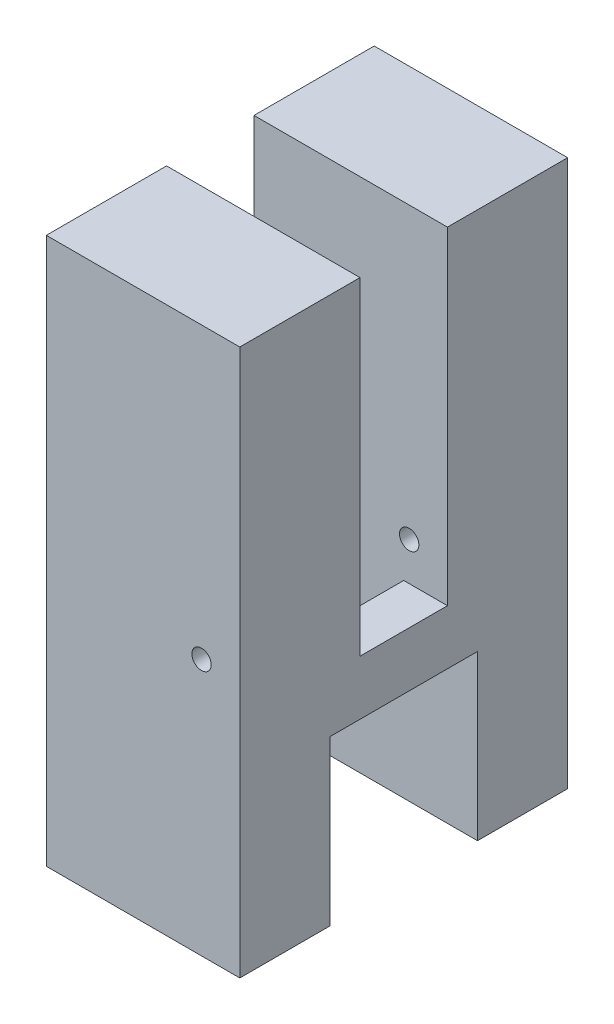
ISO-10303-21;
HEADER;
FILE_DESCRIPTION(('STEP AP214'),'2;1');
FILE_NAME('part.step','',(''),(''),'','','');
FILE_SCHEMA(('AUTOMOTIVE_DESIGN { 1 0 10303 214 1 1 1 1 }'));
ENDSEC;
DATA;
#1=APPLICATION_CONTEXT('core data for automotive mechanical design processes');
#2=APPLICATION_PROTOCOL_DEFINITION('international standard','automotive_design',2000,#1);
#3=PRODUCT_CONTEXT('',#1,'mechanical');
#4=PRODUCT('Part','Part','',(#3));
#5=PRODUCT_RELATED_PRODUCT_CATEGORY('part','',(#4));
#6=PRODUCT_DEFINITION_FORMATION('','',#4);
#7=PRODUCT_DEFINITION_CONTEXT('part definition',#1,'design');
#8=PRODUCT_DEFINITION('design','',#6,#7);
#9=PRODUCT_DEFINITION_SHAPE('','',#8);
#10=(LENGTH_UNIT() NAMED_UNIT(*) SI_UNIT(.MILLI.,.METRE.));
#11=(NAMED_UNIT(*) PLANE_ANGLE_UNIT() SI_UNIT($,.RADIAN.));
#12=(NAMED_UNIT(*) SI_UNIT($,.STERADIAN.) SOLID_ANGLE_UNIT());
#13=UNCERTAINTY_MEASURE_WITH_UNIT(LENGTH_MEASURE(1.E-05),#10,'distance_accuracy_value','');
#14=(GEOMETRIC_REPRESENTATION_CONTEXT(3) GLOBAL_UNCERTAINTY_ASSIGNED_CONTEXT((#13)) GLOBAL_UNIT_ASSIGNED_CONTEXT((#10,
#11,#12)) REPRESENTATION_CONTEXT('',''));
#15=CARTESIAN_POINT('',(0.,0.,0.));
#16=DIRECTION('',(0.,0.,1.));
#17=DIRECTION('',(1.,0.,0.));
#18=AXIS2_PLACEMENT_3D('',#15,#16,#17);
#19=CARTESIAN_POINT('',(-18.034,25.4,5.08));
#20=DIRECTION('',(0.,0.,1.));
#21=DIRECTION('',(1.,0.,0.));
#22=AXIS2_PLACEMENT_3D('',#19,#20,#21);
#23=PLANE('',#22);
#24=CARTESIAN_POINT('',(0.,29.845,5.08));
#25=DIRECTION('',(0.,0.,1.));
#26=DIRECTION('',(1.,0.,0.));
#27=AXIS2_PLACEMENT_3D('',#24,#25,#26);
#28=CIRCLE('',#27,1.125);
#29=CARTESIAN_POINT('',(1.125,29.845,5.08));
#30=VERTEX_POINT('',#29);
#31=EDGE_CURVE('E190',#30,#30,#28,.T.);
#32=ORIENTED_EDGE('',*,*,#31,.T.);
#33=EDGE_LOOP('',(#32));
#34=FACE_BOUND('',#33,.T.);
#35=DIRECTION('',(0.,-1.,0.));
#36=VECTOR('',#35,1.);
#37=CARTESIAN_POINT('',(4.445,25.4,5.08));
#38=LINE('',#37,#36);
#39=CARTESIAN_POINT('',(4.445,63.5,5.07999999999999));
#40=VERTEX_POINT('',#39);
#41=CARTESIAN_POINT('',(4.445,25.4,5.08));
#42=VERTEX_POINT('',#41);
#43=EDGE_CURVE('E203',#40,#42,#38,.T.);
#44=ORIENTED_EDGE('',*,*,#43,.T.);
#45=DIRECTION('',(1.,0.,0.));
#46=VECTOR('',#45,1.);
#47=CARTESIAN_POINT('',(-18.034,25.4,5.08));
#48=LINE('',#47,#46);
#49=CARTESIAN_POINT('',(-0.635,25.4,5.08));
#50=VERTEX_POINT('',#49);
#51=EDGE_CURVE('E60',#50,#42,#48,.T.);
#52=ORIENTED_EDGE('',*,*,#51,.F.);
#53=DIRECTION('',(0.,1.,0.));
#54=VECTOR('',#53,1.);
#55=CARTESIAN_POINT('',(-0.635,0.,5.08));
#56=LINE('',#55,#54);
#57=CARTESIAN_POINT('',(-0.635,19.05,5.08));
#58=VERTEX_POINT('',#57);
#59=EDGE_CURVE('E209',#58,#50,#56,.T.);
#60=ORIENTED_EDGE('',*,*,#59,.F.);
#61=DIRECTION('',(1.,0.,0.));
#62=VECTOR('',#61,1.);
#63=CARTESIAN_POINT('',(0.,19.05,5.08));
#64=LINE('',#63,#62);
#65=CARTESIAN_POINT('',(-18.034,19.05,5.08));
#66=VERTEX_POINT('',#65);
#67=EDGE_CURVE('E45',#66,#58,#64,.T.);
#68=ORIENTED_EDGE('',*,*,#67,.F.);
#69=DIRECTION('',(0.,1.,0.));
#70=VECTOR('',#69,1.);
#71=CARTESIAN_POINT('',(-18.034,25.4,5.08));
#72=LINE('',#71,#70);
#73=CARTESIAN_POINT('',(-18.034,63.5,5.08));
#74=VERTEX_POINT('',#73);
#75=EDGE_CURVE('E164',#66,#74,#72,.T.);
#76=ORIENTED_EDGE('',*,*,#75,.T.);
#77=DIRECTION('',(1.,0.,0.));
#78=VECTOR('',#77,1.);
#79=CARTESIAN_POINT('',(-18.034,63.5,5.08));
#80=LINE('',#79,#78);
#81=EDGE_CURVE('E233',#74,#40,#80,.T.);
#82=ORIENTED_EDGE('',*,*,#81,.T.);
#83=EDGE_LOOP('',(#44,#52,#60,#68,#76,#82));
#84=FACE_BOUND('',#83,.T.);
#85=ADVANCED_FACE('F37',(#34,#84),#23,.F.);
#86=CARTESIAN_POINT('',(-18.034,25.4,-5.08));
#87=DIRECTION('',(0.,0.,-1.));
#88=DIRECTION('',(-1.,0.,0.));
#89=AXIS2_PLACEMENT_3D('',#86,#87,#88);
#90=PLANE('',#89);
#91=CARTESIAN_POINT('',(0.,29.845,-5.08));
#92=DIRECTION('',(0.,0.,-1.));
#93=DIRECTION('',(-1.,0.,0.));
#94=AXIS2_PLACEMENT_3D('',#91,#92,#93);
#95=CIRCLE('',#94,1.125);
#96=CARTESIAN_POINT('',(-1.125,29.845,-5.08));
#97=VERTEX_POINT('',#96);
#98=EDGE_CURVE('E188',#97,#97,#95,.T.);
#99=ORIENTED_EDGE('',*,*,#98,.T.);
#100=EDGE_LOOP('',(#99));
#101=FACE_BOUND('',#100,.T.);
#102=DIRECTION('',(-1.,0.,0.));
#103=VECTOR('',#102,1.);
#104=CARTESIAN_POINT('',(-18.034,25.4,-5.08));
#105=LINE('',#104,#103);
#106=CARTESIAN_POINT('',(4.445,25.4,-5.08));
#107=VERTEX_POINT('',#106);
#108=CARTESIAN_POINT('',(-0.635,25.4,-5.08));
#109=VERTEX_POINT('',#108);
#110=EDGE_CURVE('E52',#107,#109,#105,.T.);
#111=ORIENTED_EDGE('',*,*,#110,.F.);
#112=DIRECTION('',(0.,1.,0.));
#113=VECTOR('',#112,1.);
#114=CARTESIAN_POINT('',(4.445,25.4,-5.08));
#115=LINE('',#114,#113);
#116=CARTESIAN_POINT('',(4.445,63.5,-5.08));
#117=VERTEX_POINT('',#116);
#118=EDGE_CURVE('E262',#107,#117,#115,.T.);
#119=ORIENTED_EDGE('',*,*,#118,.T.);
#120=DIRECTION('',(-1.,0.,0.));
#121=VECTOR('',#120,1.);
#122=CARTESIAN_POINT('',(-18.034,63.5,-5.08));
#123=LINE('',#122,#121);
#124=CARTESIAN_POINT('',(-18.034,63.5,-5.08));
#125=VERTEX_POINT('',#124);
#126=EDGE_CURVE('E223',#117,#125,#123,.T.);
#127=ORIENTED_EDGE('',*,*,#126,.T.);
#128=DIRECTION('',(0.,1.,0.));
#129=VECTOR('',#128,1.);
#130=CARTESIAN_POINT('',(-18.034,25.4,-5.08));
#131=LINE('',#130,#129);
#132=CARTESIAN_POINT('',(-18.034,19.05,-5.08));
#133=VERTEX_POINT('',#132);
#134=EDGE_CURVE('E167',#133,#125,#131,.T.);
#135=ORIENTED_EDGE('',*,*,#134,.F.);
#136=DIRECTION('',(-1.,0.,0.));
#137=VECTOR('',#136,1.);
#138=CARTESIAN_POINT('',(0.,19.05,-5.08));
#139=LINE('',#138,#137);
#140=CARTESIAN_POINT('',(-0.635,19.05,-5.08));
#141=VERTEX_POINT('',#140);
#142=EDGE_CURVE('E184',#141,#133,#139,.T.);
#143=ORIENTED_EDGE('',*,*,#142,.F.);
#144=DIRECTION('',(0.,1.,0.));
#145=VECTOR('',#144,1.);
#146=CARTESIAN_POINT('',(-0.635,0.,-5.08));
#147=LINE('',#146,#145);
#148=EDGE_CURVE('E210',#141,#109,#147,.T.);
#149=ORIENTED_EDGE('',*,*,#148,.T.);
#150=EDGE_LOOP('',(#111,#119,#127,#135,#143,#149));
#151=FACE_BOUND('',#150,.T.);
#152=ADVANCED_FACE('F297',(#101,#151),#90,.F.);
#153=CARTESIAN_POINT('',(-18.034,63.5,-19.05));
#154=DIRECTION('',(1.,0.,0.));
#155=DIRECTION('',(0.,0.,-1.));
#156=AXIS2_PLACEMENT_3D('',#153,#154,#155);
#157=PLANE('',#156);
#158=ORIENTED_EDGE('',*,*,#75,.F.);
#159=DIRECTION('',(0.,0.,-1.));
#160=VECTOR('',#159,1.);
#161=CARTESIAN_POINT('',(-18.034,19.05,-8.5725));
#162=LINE('',#161,#160);
#163=CARTESIAN_POINT('',(-18.034,19.05,8.5725));
#164=VERTEX_POINT('',#163);
#165=EDGE_CURVE('E225',#164,#66,#162,.T.);
#166=ORIENTED_EDGE('',*,*,#165,.F.);
#167=DIRECTION('',(0.,-1.,0.));
#168=VECTOR('',#167,1.);
#169=CARTESIAN_POINT('',(-18.034,65.3355937604538,8.5725));
#170=LINE('',#169,#168);
#171=CARTESIAN_POINT('',(-18.034,0.,8.5725));
#172=VERTEX_POINT('',#171);
#173=EDGE_CURVE('E219',#164,#172,#170,.T.);
#174=ORIENTED_EDGE('',*,*,#173,.T.);
#175=DIRECTION('',(0.,0.,1.));
#176=VECTOR('',#175,1.);
#177=CARTESIAN_POINT('',(-18.034,0.,-19.05));
#178=LINE('',#177,#176);
#179=CARTESIAN_POINT('',(-18.034,0.,19.05));
#180=VERTEX_POINT('',#179);
#181=EDGE_CURVE('E163',#172,#180,#178,.T.);
#182=ORIENTED_EDGE('',*,*,#181,.T.);
#183=DIRECTION('',(0.,-1.,0.));
#184=VECTOR('',#183,1.);
#185=CARTESIAN_POINT('',(-18.034,63.5,19.05));
#186=LINE('',#185,#184);
#187=CARTESIAN_POINT('',(-18.034,63.5,19.05));
#188=VERTEX_POINT('',#187);
#189=EDGE_CURVE('E176',#188,#180,#186,.T.);
#190=ORIENTED_EDGE('',*,*,#189,.F.);
#191=DIRECTION('',(0.,0.,1.));
#192=VECTOR('',#191,1.);
#193=CARTESIAN_POINT('',(-18.034,63.5,-19.05));
#194=LINE('',#193,#192);
#195=EDGE_CURVE('E240',#74,#188,#194,.T.);
#196=ORIENTED_EDGE('',*,*,#195,.F.);
#197=EDGE_LOOP('',(#158,#166,#174,#182,#190,#196));
#198=FACE_BOUND('',#197,.T.);
#199=ADVANCED_FACE('F255',(#198),#157,.F.);
#200=CARTESIAN_POINT('',(0.,25.4,0.));
#201=DIRECTION('',(0.,1.,0.));
#202=DIRECTION('',(0.,0.,1.));
#203=AXIS2_PLACEMENT_3D('',#200,#201,#202);
#204=PLANE('',#203);
#205=DIRECTION('',(0.,0.,-1.));
#206=VECTOR('',#205,1.);
#207=CARTESIAN_POINT('',(-0.635,25.4,0.));
#208=LINE('',#207,#206);
#209=EDGE_CURVE('E195',#50,#109,#208,.T.);
#210=ORIENTED_EDGE('',*,*,#209,.F.);
#211=ORIENTED_EDGE('',*,*,#51,.T.);
#212=DIRECTION('',(0.,0.,-1.));
#213=VECTOR('',#212,1.);
#214=CARTESIAN_POINT('',(4.445,25.4,5.08));
#215=LINE('',#214,#213);
#216=EDGE_CURVE('E276',#42,#107,#215,.T.);
#217=ORIENTED_EDGE('',*,*,#216,.T.);
#218=ORIENTED_EDGE('',*,*,#110,.T.);
#219=EDGE_LOOP('',(#210,#211,#217,#218));
#220=FACE_BOUND('',#219,.T.);
#221=ADVANCED_FACE('F301',(#220),#204,.T.);
#222=CARTESIAN_POINT('',(0.,0.,0.));
#223=DIRECTION('',(0.,1.,0.));
#224=DIRECTION('',(0.,0.,1.));
#225=AXIS2_PLACEMENT_3D('',#222,#223,#224);
#226=PLANE('',#225);
#227=DIRECTION('',(-1.,0.,0.));
#228=VECTOR('',#227,1.);
#229=CARTESIAN_POINT('',(-18.034,0.,8.5725));
#230=LINE('',#229,#228);
#231=CARTESIAN_POINT('',(4.445,0.,8.5725));
#232=VERTEX_POINT('',#231);
#233=EDGE_CURVE('E212',#232,#172,#230,.T.);
#234=ORIENTED_EDGE('',*,*,#233,.F.);
#235=DIRECTION('',(0.,0.,1.));
#236=VECTOR('',#235,1.);
#237=CARTESIAN_POINT('',(4.445,0.,-19.05));
#238=LINE('',#237,#236);
#239=CARTESIAN_POINT('',(4.445,0.,19.05));
#240=VERTEX_POINT('',#239);
#241=EDGE_CURVE('E149',#232,#240,#238,.T.);
#242=ORIENTED_EDGE('',*,*,#241,.T.);
#243=DIRECTION('',(1.,0.,0.));
#244=VECTOR('',#243,1.);
#245=CARTESIAN_POINT('',(-18.034,0.,19.05));
#246=LINE('',#245,#244);
#247=EDGE_CURVE('E173',#180,#240,#246,.T.);
#248=ORIENTED_EDGE('',*,*,#247,.F.);
#249=ORIENTED_EDGE('',*,*,#181,.F.);
#250=EDGE_LOOP('',(#234,#242,#248,#249));
#251=FACE_BOUND('',#250,.T.);
#252=ADVANCED_FACE('F281',(#251),#226,.F.);
#253=CARTESIAN_POINT('',(0.,63.5,0.));
#254=DIRECTION('',(0.,1.,0.));
#255=DIRECTION('',(0.,0.,1.));
#256=AXIS2_PLACEMENT_3D('',#253,#254,#255);
#257=PLANE('',#256);
#258=DIRECTION('',(0.,0.,1.));
#259=VECTOR('',#258,1.);
#260=CARTESIAN_POINT('',(4.445,63.5,-19.05));
#261=LINE('',#260,#259);
#262=CARTESIAN_POINT('',(4.445,63.5,19.05));
#263=VERTEX_POINT('',#262);
#264=EDGE_CURVE('E277',#40,#263,#261,.T.);
#265=ORIENTED_EDGE('',*,*,#264,.F.);
#266=ORIENTED_EDGE('',*,*,#81,.F.);
#267=ORIENTED_EDGE('',*,*,#195,.T.);
#268=DIRECTION('',(1.,0.,0.));
#269=VECTOR('',#268,1.);
#270=CARTESIAN_POINT('',(-18.034,63.5,19.05));
#271=LINE('',#270,#269);
#272=EDGE_CURVE('E170',#188,#263,#271,.T.);
#273=ORIENTED_EDGE('',*,*,#272,.T.);
#274=EDGE_LOOP('',(#265,#266,#267,#273));
#275=FACE_BOUND('',#274,.T.);
#276=ADVANCED_FACE('F252',(#275),#257,.T.);
#277=CARTESIAN_POINT('',(-18.034,63.5,-19.05));
#278=DIRECTION('',(0.,0.,1.));
#279=DIRECTION('',(1.,0.,0.));
#280=AXIS2_PLACEMENT_3D('',#277,#278,#279);
#281=PLANE('',#280);
#282=CARTESIAN_POINT('',(0.,29.845,-19.05));
#283=DIRECTION('',(0.,0.,1.));
#284=DIRECTION('',(1.,0.,0.));
#285=AXIS2_PLACEMENT_3D('',#282,#283,#284);
#286=CIRCLE('',#285,1.125);
#287=CARTESIAN_POINT('',(1.125,29.845,-19.05));
#288=VERTEX_POINT('',#287);
#289=EDGE_CURVE('E191',#288,#288,#286,.T.);
#290=ORIENTED_EDGE('',*,*,#289,.T.);
#291=EDGE_LOOP('',(#290));
#292=FACE_BOUND('',#291,.T.);
#293=DIRECTION('',(-1.,0.,0.));
#294=VECTOR('',#293,1.);
#295=CARTESIAN_POINT('',(-18.034,63.5,-19.05));
#296=LINE('',#295,#294);
#297=CARTESIAN_POINT('',(4.445,63.5,-19.05));
#298=VERTEX_POINT('',#297);
#299=CARTESIAN_POINT('',(-18.034,63.5,-19.05));
#300=VERTEX_POINT('',#299);
#301=EDGE_CURVE('E156',#298,#300,#296,.T.);
#302=ORIENTED_EDGE('',*,*,#301,.F.);
#303=DIRECTION('',(0.,1.,0.));
#304=VECTOR('',#303,1.);
#305=CARTESIAN_POINT('',(4.445,0.,-19.05));
#306=LINE('',#305,#304);
#307=CARTESIAN_POINT('',(4.445,0.,-19.05));
#308=VERTEX_POINT('',#307);
#309=EDGE_CURVE('E143',#308,#298,#306,.T.);
#310=ORIENTED_EDGE('',*,*,#309,.F.);
#311=DIRECTION('',(-1.,0.,0.));
#312=VECTOR('',#311,1.);
#313=CARTESIAN_POINT('',(-18.034,0.,-19.05));
#314=LINE('',#313,#312);
#315=CARTESIAN_POINT('',(-18.034,0.,-19.05));
#316=VERTEX_POINT('',#315);
#317=EDGE_CURVE('E154',#308,#316,#314,.T.);
#318=ORIENTED_EDGE('',*,*,#317,.T.);
#319=DIRECTION('',(0.,-1.,0.));
#320=VECTOR('',#319,1.);
#321=CARTESIAN_POINT('',(-18.034,63.5,-19.05));
#322=LINE('',#321,#320);
#323=EDGE_CURVE('E179',#300,#316,#322,.T.);
#324=ORIENTED_EDGE('',*,*,#323,.F.);
#325=EDGE_LOOP('',(#302,#310,#318,#324));
#326=FACE_BOUND('',#325,.T.);
#327=ADVANCED_FACE('F39',(#292,#326),#281,.F.);
#328=CARTESIAN_POINT('',(-18.034,19.05,-8.5725));
#329=VERTEX_POINT('',#328);
#330=EDGE_CURVE('E228',#133,#329,#162,.T.);
#331=ORIENTED_EDGE('',*,*,#330,.F.);
#332=ORIENTED_EDGE('',*,*,#134,.T.);
#333=EDGE_CURVE('E241',#300,#125,#194,.T.);
#334=ORIENTED_EDGE('',*,*,#333,.F.);
#335=ORIENTED_EDGE('',*,*,#323,.T.);
#336=CARTESIAN_POINT('',(-18.034,0.,-8.5725));
#337=VERTEX_POINT('',#336);
#338=EDGE_CURVE('E162',#316,#337,#178,.T.);
#339=ORIENTED_EDGE('',*,*,#338,.T.);
#340=DIRECTION('',(0.,-1.,0.));
#341=VECTOR('',#340,1.);
#342=CARTESIAN_POINT('',(-18.034,65.3355937604538,-8.5725));
#343=LINE('',#342,#341);
#344=EDGE_CURVE('E224',#329,#337,#343,.T.);
#345=ORIENTED_EDGE('',*,*,#344,.F.);
#346=EDGE_LOOP('',(#331,#332,#334,#335,#339,#345));
#347=FACE_BOUND('',#346,.T.);
#348=ADVANCED_FACE('F295',(#347),#157,.F.);
#349=CARTESIAN_POINT('',(-18.034,63.5,19.05));
#350=DIRECTION('',(0.,0.,-1.));
#351=DIRECTION('',(-1.,0.,0.));
#352=AXIS2_PLACEMENT_3D('',#349,#350,#351);
#353=PLANE('',#352);
#354=CARTESIAN_POINT('',(0.,29.845,19.05));
#355=DIRECTION('',(0.,0.,1.));
#356=DIRECTION('',(1.,0.,0.));
#357=AXIS2_PLACEMENT_3D('',#354,#355,#356);
#358=CIRCLE('',#357,1.125);
#359=CARTESIAN_POINT('',(1.125,29.845,19.05));
#360=VERTEX_POINT('',#359);
#361=EDGE_CURVE('E198',#360,#360,#358,.T.);
#362=ORIENTED_EDGE('',*,*,#361,.F.);
#363=EDGE_LOOP('',(#362));
#364=FACE_BOUND('',#363,.T.);
#365=ORIENTED_EDGE('',*,*,#247,.T.);
#366=DIRECTION('',(0.,1.,0.));
#367=VECTOR('',#366,1.);
#368=CARTESIAN_POINT('',(4.445,0.,19.05));
#369=LINE('',#368,#367);
#370=EDGE_CURVE('E157',#240,#263,#369,.T.);
#371=ORIENTED_EDGE('',*,*,#370,.T.);
#372=ORIENTED_EDGE('',*,*,#272,.F.);
#373=ORIENTED_EDGE('',*,*,#189,.T.);
#374=EDGE_LOOP('',(#365,#371,#372,#373));
#375=FACE_BOUND('',#374,.T.);
#376=ADVANCED_FACE('F260',(#364,#375),#353,.F.);
#377=EDGE_CURVE('E267',#298,#117,#261,.T.);
#378=ORIENTED_EDGE('',*,*,#377,.F.);
#379=ORIENTED_EDGE('',*,*,#301,.T.);
#380=ORIENTED_EDGE('',*,*,#333,.T.);
#381=ORIENTED_EDGE('',*,*,#126,.F.);
#382=EDGE_LOOP('',(#378,#379,#380,#381));
#383=FACE_BOUND('',#382,.T.);
#384=ADVANCED_FACE('F318',(#383),#257,.T.);
#385=ORIENTED_EDGE('',*,*,#317,.F.);
#386=CARTESIAN_POINT('',(4.445,0.,-8.5725));
#387=VERTEX_POINT('',#386);
#388=EDGE_CURVE('E139',#308,#387,#238,.T.);
#389=ORIENTED_EDGE('',*,*,#388,.T.);
#390=DIRECTION('',(1.,0.,0.));
#391=VECTOR('',#390,1.);
#392=CARTESIAN_POINT('',(-18.034,0.,-8.5725));
#393=LINE('',#392,#391);
#394=EDGE_CURVE('E214',#337,#387,#393,.T.);
#395=ORIENTED_EDGE('',*,*,#394,.F.);
#396=ORIENTED_EDGE('',*,*,#338,.F.);
#397=EDGE_LOOP('',(#385,#389,#395,#396));
#398=FACE_BOUND('',#397,.T.);
#399=ADVANCED_FACE('F160',(#398),#226,.F.);
#400=CARTESIAN_POINT('',(0.,19.05,0.));
#401=DIRECTION('',(0.,1.,0.));
#402=DIRECTION('',(0.,0.,1.));
#403=AXIS2_PLACEMENT_3D('',#400,#401,#402);
#404=PLANE('',#403);
#405=DIRECTION('',(1.,0.,0.));
#406=VECTOR('',#405,1.);
#407=CARTESIAN_POINT('',(-18.034,19.05,-8.5725));
#408=LINE('',#407,#406);
#409=CARTESIAN_POINT('',(4.445,19.05,-8.5725));
#410=VERTEX_POINT('',#409);
#411=EDGE_CURVE('E220',#329,#410,#408,.T.);
#412=ORIENTED_EDGE('',*,*,#411,.T.);
#413=DIRECTION('',(0.,0.,1.));
#414=VECTOR('',#413,1.);
#415=CARTESIAN_POINT('',(4.445,19.05,0.));
#416=LINE('',#415,#414);
#417=CARTESIAN_POINT('',(4.445,19.05,8.5725));
#418=VERTEX_POINT('',#417);
#419=EDGE_CURVE('E269',#410,#418,#416,.T.);
#420=ORIENTED_EDGE('',*,*,#419,.T.);
#421=DIRECTION('',(-1.,0.,0.));
#422=VECTOR('',#421,1.);
#423=CARTESIAN_POINT('',(-18.034,19.05,8.5725));
#424=LINE('',#423,#422);
#425=EDGE_CURVE('E216',#418,#164,#424,.T.);
#426=ORIENTED_EDGE('',*,*,#425,.T.);
#427=ORIENTED_EDGE('',*,*,#165,.T.);
#428=ORIENTED_EDGE('',*,*,#67,.T.);
#429=DIRECTION('',(0.,0.,-1.));
#430=VECTOR('',#429,1.);
#431=CARTESIAN_POINT('',(-0.635,19.05,0.));
#432=LINE('',#431,#430);
#433=EDGE_CURVE('E181',#58,#141,#432,.T.);
#434=ORIENTED_EDGE('',*,*,#433,.T.);
#435=ORIENTED_EDGE('',*,*,#142,.T.);
#436=ORIENTED_EDGE('',*,*,#330,.T.);
#437=EDGE_LOOP('',(#412,#420,#426,#427,#428,#434,#435,#436));
#438=FACE_BOUND('',#437,.T.);
#439=ADVANCED_FACE('F288',(#438),#404,.F.);
#440=CARTESIAN_POINT('',(-18.034,65.3355937604538,8.5725));
#441=DIRECTION('',(0.,0.,1.));
#442=DIRECTION('',(1.,0.,0.));
#443=AXIS2_PLACEMENT_3D('',#440,#441,#442);
#444=PLANE('',#443);
#445=ORIENTED_EDGE('',*,*,#425,.F.);
#446=DIRECTION('',(0.,-1.,0.));
#447=VECTOR('',#446,1.);
#448=CARTESIAN_POINT('',(4.445,65.3355937604538,8.5725));
#449=LINE('',#448,#447);
#450=EDGE_CURVE('E264',#418,#232,#449,.T.);
#451=ORIENTED_EDGE('',*,*,#450,.T.);
#452=ORIENTED_EDGE('',*,*,#233,.T.);
#453=ORIENTED_EDGE('',*,*,#173,.F.);
#454=EDGE_LOOP('',(#445,#451,#452,#453));
#455=FACE_BOUND('',#454,.T.);
#456=ADVANCED_FACE('F284',(#455),#444,.F.);
#457=CARTESIAN_POINT('',(-18.034,65.3355937604538,-8.5725));
#458=DIRECTION('',(0.,0.,-1.));
#459=DIRECTION('',(-1.,0.,0.));
#460=AXIS2_PLACEMENT_3D('',#457,#458,#459);
#461=PLANE('',#460);
#462=ORIENTED_EDGE('',*,*,#394,.T.);
#463=DIRECTION('',(0.,1.,0.));
#464=VECTOR('',#463,1.);
#465=CARTESIAN_POINT('',(4.445,65.3355937604538,-8.5725));
#466=LINE('',#465,#464);
#467=EDGE_CURVE('E12',#387,#410,#466,.T.);
#468=ORIENTED_EDGE('',*,*,#467,.T.);
#469=ORIENTED_EDGE('',*,*,#411,.F.);
#470=ORIENTED_EDGE('',*,*,#344,.T.);
#471=EDGE_LOOP('',(#462,#468,#469,#470));
#472=FACE_BOUND('',#471,.T.);
#473=ADVANCED_FACE('F291',(#472),#461,.F.);
#474=CARTESIAN_POINT('',(-0.635,0.,0.));
#475=DIRECTION('',(1.,0.,0.));
#476=DIRECTION('',(0.,0.,-1.));
#477=AXIS2_PLACEMENT_3D('',#474,#475,#476);
#478=PLANE('',#477);
#479=ORIENTED_EDGE('',*,*,#59,.T.);
#480=ORIENTED_EDGE('',*,*,#209,.T.);
#481=ORIENTED_EDGE('',*,*,#148,.F.);
#482=ORIENTED_EDGE('',*,*,#433,.F.);
#483=EDGE_LOOP('',(#479,#480,#481,#482));
#484=FACE_BOUND('',#483,.T.);
#485=ADVANCED_FACE('F300',(#484),#478,.F.);
#486=CARTESIAN_POINT('',(0.,29.845,-19.05));
#487=DIRECTION('',(0.,0.,1.));
#488=DIRECTION('',(1.,0.,0.));
#489=AXIS2_PLACEMENT_3D('',#486,#487,#488);
#490=CYLINDRICAL_SURFACE('',#489,1.125);
#491=ORIENTED_EDGE('',*,*,#289,.F.);
#492=EDGE_LOOP('',(#491));
#493=FACE_BOUND('',#492,.T.);
#494=ORIENTED_EDGE('',*,*,#98,.F.);
#495=EDGE_LOOP('',(#494));
#496=FACE_BOUND('',#495,.T.);
#497=ADVANCED_FACE('F348',(#493,#496),#490,.F.);
#498=ORIENTED_EDGE('',*,*,#361,.T.);
#499=EDGE_LOOP('',(#498));
#500=FACE_BOUND('',#499,.T.);
#501=ORIENTED_EDGE('',*,*,#31,.F.);
#502=EDGE_LOOP('',(#501));
#503=FACE_BOUND('',#502,.T.);
#504=ADVANCED_FACE('F343',(#500,#503),#490,.F.);
#505=CARTESIAN_POINT('',(4.445,0.,-19.05));
#506=DIRECTION('',(-1.,0.,0.));
#507=DIRECTION('',(0.,0.,1.));
#508=AXIS2_PLACEMENT_3D('',#505,#506,#507);
#509=PLANE('',#508);
#510=ORIENTED_EDGE('',*,*,#264,.T.);
#511=ORIENTED_EDGE('',*,*,#370,.F.);
#512=ORIENTED_EDGE('',*,*,#241,.F.);
#513=ORIENTED_EDGE('',*,*,#450,.F.);
#514=ORIENTED_EDGE('',*,*,#419,.F.);
#515=ORIENTED_EDGE('',*,*,#467,.F.);
#516=ORIENTED_EDGE('',*,*,#388,.F.);
#517=ORIENTED_EDGE('',*,*,#309,.T.);
#518=ORIENTED_EDGE('',*,*,#377,.T.);
#519=ORIENTED_EDGE('',*,*,#118,.F.);
#520=ORIENTED_EDGE('',*,*,#216,.F.);
#521=ORIENTED_EDGE('',*,*,#43,.F.);
#522=EDGE_LOOP('',(#510,#511,#512,#513,#514,#515,#516,#517,#518,#519,#520,#521));
#523=FACE_BOUND('',#522,.T.);
#524=ADVANCED_FACE('F141',(#523),#509,.F.);
#525=CLOSED_SHELL('',(#85,#152,#199,#221,#252,#276,#327,#348,#376,#384,#399,#439,#456,#473,#485,
#497,#504,#524));
#526=MANIFOLD_SOLID_BREP('B2',#525);
#527=ADVANCED_BREP_SHAPE_REPRESENTATION('',(#18,#526),#14);
#528=SHAPE_DEFINITION_REPRESENTATION(#9,#527);
ENDSEC;
END-ISO-10303-21;
